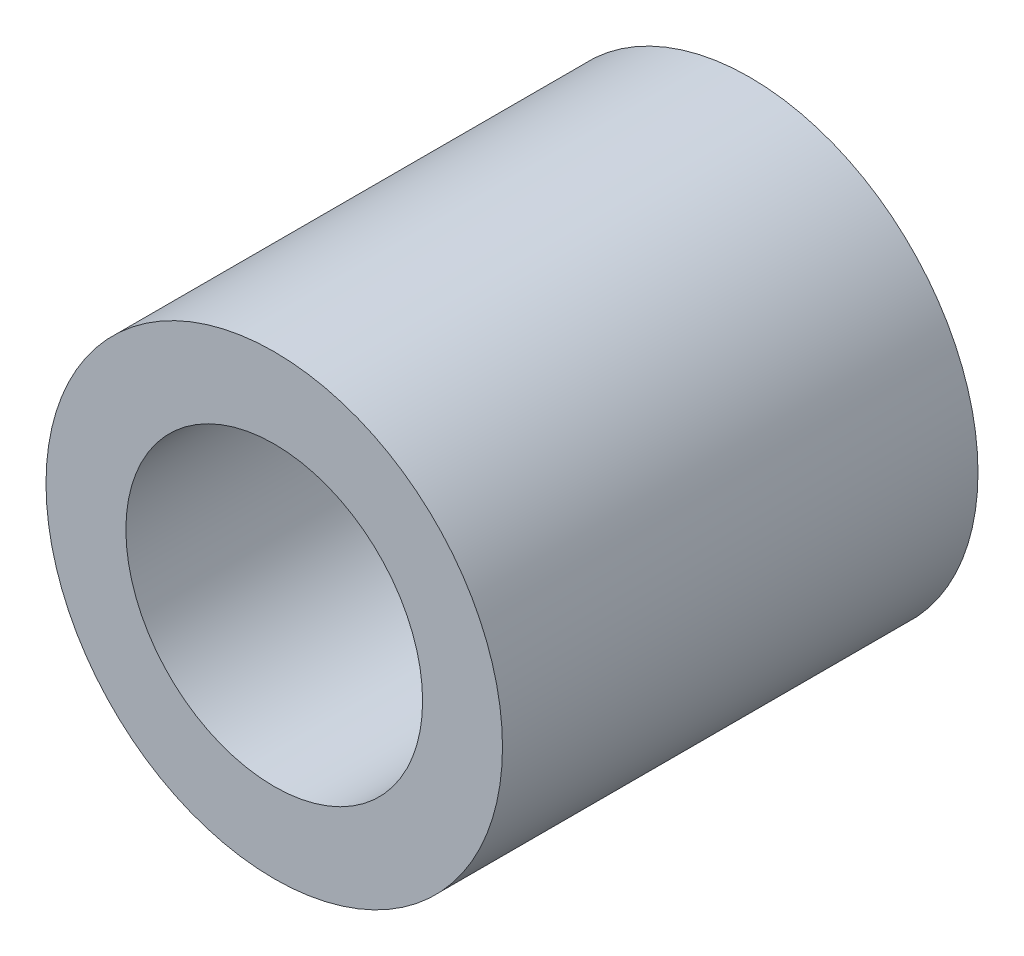
ISO-10303-21;
HEADER;
FILE_DESCRIPTION(('STEP AP214'),'2;1');
FILE_NAME('part.step','',(''),(''),'','','');
FILE_SCHEMA(('AUTOMOTIVE_DESIGN { 1 0 10303 214 1 1 1 1 }'));
ENDSEC;
DATA;
#1=APPLICATION_CONTEXT('core data for automotive mechanical design processes');
#2=APPLICATION_PROTOCOL_DEFINITION('international standard','automotive_design',2000,#1);
#3=PRODUCT_CONTEXT('',#1,'mechanical');
#4=PRODUCT('Part','Part','',(#3));
#5=PRODUCT_RELATED_PRODUCT_CATEGORY('part','',(#4));
#6=PRODUCT_DEFINITION_FORMATION('','',#4);
#7=PRODUCT_DEFINITION_CONTEXT('part definition',#1,'design');
#8=PRODUCT_DEFINITION('design','',#6,#7);
#9=PRODUCT_DEFINITION_SHAPE('','',#8);
#10=(LENGTH_UNIT() NAMED_UNIT(*) SI_UNIT(.MILLI.,.METRE.));
#11=(NAMED_UNIT(*) PLANE_ANGLE_UNIT() SI_UNIT($,.RADIAN.));
#12=(NAMED_UNIT(*) SI_UNIT($,.STERADIAN.) SOLID_ANGLE_UNIT());
#13=UNCERTAINTY_MEASURE_WITH_UNIT(LENGTH_MEASURE(1.E-05),#10,'distance_accuracy_value','');
#14=(GEOMETRIC_REPRESENTATION_CONTEXT(3) GLOBAL_UNCERTAINTY_ASSIGNED_CONTEXT((#13)) GLOBAL_UNIT_ASSIGNED_CONTEXT((#10,
#11,#12)) REPRESENTATION_CONTEXT('',''));
#15=CARTESIAN_POINT('',(0.,0.,0.));
#16=DIRECTION('',(0.,0.,1.));
#17=DIRECTION('',(1.,0.,0.));
#18=AXIS2_PLACEMENT_3D('',#15,#16,#17);
#19=CARTESIAN_POINT('',(0.,0.,22.225));
#20=DIRECTION('',(0.,0.,1.));
#21=DIRECTION('',(1.,0.,0.));
#22=AXIS2_PLACEMENT_3D('',#19,#20,#21);
#23=PLANE('',#22);
#24=CARTESIAN_POINT('',(0.,0.,22.225));
#25=DIRECTION('',(0.,0.,1.));
#26=DIRECTION('',(1.,0.,0.));
#27=AXIS2_PLACEMENT_3D('',#24,#25,#26);
#28=CIRCLE('',#27,10.668);
#29=CARTESIAN_POINT('',(10.668,0.,22.225));
#30=VERTEX_POINT('',#29);
#31=EDGE_CURVE('E10',#30,#30,#28,.T.);
#32=ORIENTED_EDGE('',*,*,#31,.T.);
#33=EDGE_LOOP('',(#32));
#34=FACE_BOUND('',#33,.T.);
#35=CARTESIAN_POINT('',(0.,0.,22.225));
#36=DIRECTION('',(0.,0.,1.));
#37=DIRECTION('',(1.,0.,0.));
#38=AXIS2_PLACEMENT_3D('',#35,#36,#37);
#39=CIRCLE('',#38,6.9342);
#40=CARTESIAN_POINT('',(6.9342,0.,22.225));
#41=VERTEX_POINT('',#40);
#42=EDGE_CURVE('E42',#41,#41,#39,.T.);
#43=ORIENTED_EDGE('',*,*,#42,.F.);
#44=EDGE_LOOP('',(#43));
#45=FACE_BOUND('',#44,.T.);
#46=ADVANCED_FACE('F31',(#34,#45),#23,.T.);
#47=CARTESIAN_POINT('',(0.,0.,0.));
#48=DIRECTION('',(0.,0.,1.));
#49=DIRECTION('',(1.,0.,0.));
#50=AXIS2_PLACEMENT_3D('',#47,#48,#49);
#51=PLANE('',#50);
#52=CARTESIAN_POINT('',(0.,0.,0.));
#53=DIRECTION('',(0.,0.,1.));
#54=DIRECTION('',(1.,0.,0.));
#55=AXIS2_PLACEMENT_3D('',#52,#53,#54);
#56=CIRCLE('',#55,10.668);
#57=CARTESIAN_POINT('',(10.668,0.,0.));
#58=VERTEX_POINT('',#57);
#59=EDGE_CURVE('E35',#58,#58,#56,.T.);
#60=ORIENTED_EDGE('',*,*,#59,.F.);
#61=EDGE_LOOP('',(#60));
#62=FACE_BOUND('',#61,.T.);
#63=CARTESIAN_POINT('',(0.,0.,0.));
#64=DIRECTION('',(0.,0.,1.));
#65=DIRECTION('',(1.,0.,0.));
#66=AXIS2_PLACEMENT_3D('',#63,#64,#65);
#67=CIRCLE('',#66,6.9342);
#68=CARTESIAN_POINT('',(6.9342,0.,0.));
#69=VERTEX_POINT('',#68);
#70=EDGE_CURVE('E44',#69,#69,#67,.T.);
#71=ORIENTED_EDGE('',*,*,#70,.T.);
#72=EDGE_LOOP('',(#71));
#73=FACE_BOUND('',#72,.T.);
#74=ADVANCED_FACE('F54',(#62,#73),#51,.F.);
#75=CARTESIAN_POINT('',(0.,0.,22.225));
#76=DIRECTION('',(0.,0.,-1.));
#77=DIRECTION('',(-1.,0.,0.));
#78=AXIS2_PLACEMENT_3D('',#75,#76,#77);
#79=CYLINDRICAL_SURFACE('',#78,10.668);
#80=ORIENTED_EDGE('',*,*,#31,.F.);
#81=EDGE_LOOP('',(#80));
#82=FACE_BOUND('',#81,.T.);
#83=ORIENTED_EDGE('',*,*,#59,.T.);
#84=EDGE_LOOP('',(#83));
#85=FACE_BOUND('',#84,.T.);
#86=ADVANCED_FACE('F33',(#82,#85),#79,.T.);
#87=CARTESIAN_POINT('',(0.,0.,22.225));
#88=DIRECTION('',(0.,0.,-1.));
#89=DIRECTION('',(-1.,0.,0.));
#90=AXIS2_PLACEMENT_3D('',#87,#88,#89);
#91=CYLINDRICAL_SURFACE('',#90,6.9342);
#92=ORIENTED_EDGE('',*,*,#42,.T.);
#93=EDGE_LOOP('',(#92));
#94=FACE_BOUND('',#93,.T.);
#95=ORIENTED_EDGE('',*,*,#70,.F.);
#96=EDGE_LOOP('',(#95));
#97=FACE_BOUND('',#96,.T.);
#98=ADVANCED_FACE('F50',(#94,#97),#91,.F.);
#99=CLOSED_SHELL('',(#46,#74,#86,#98));
#100=MANIFOLD_SOLID_BREP('B2',#99);
#101=ADVANCED_BREP_SHAPE_REPRESENTATION('',(#18,#100),#14);
#102=SHAPE_DEFINITION_REPRESENTATION(#9,#101);
ENDSEC;
END-ISO-10303-21;
